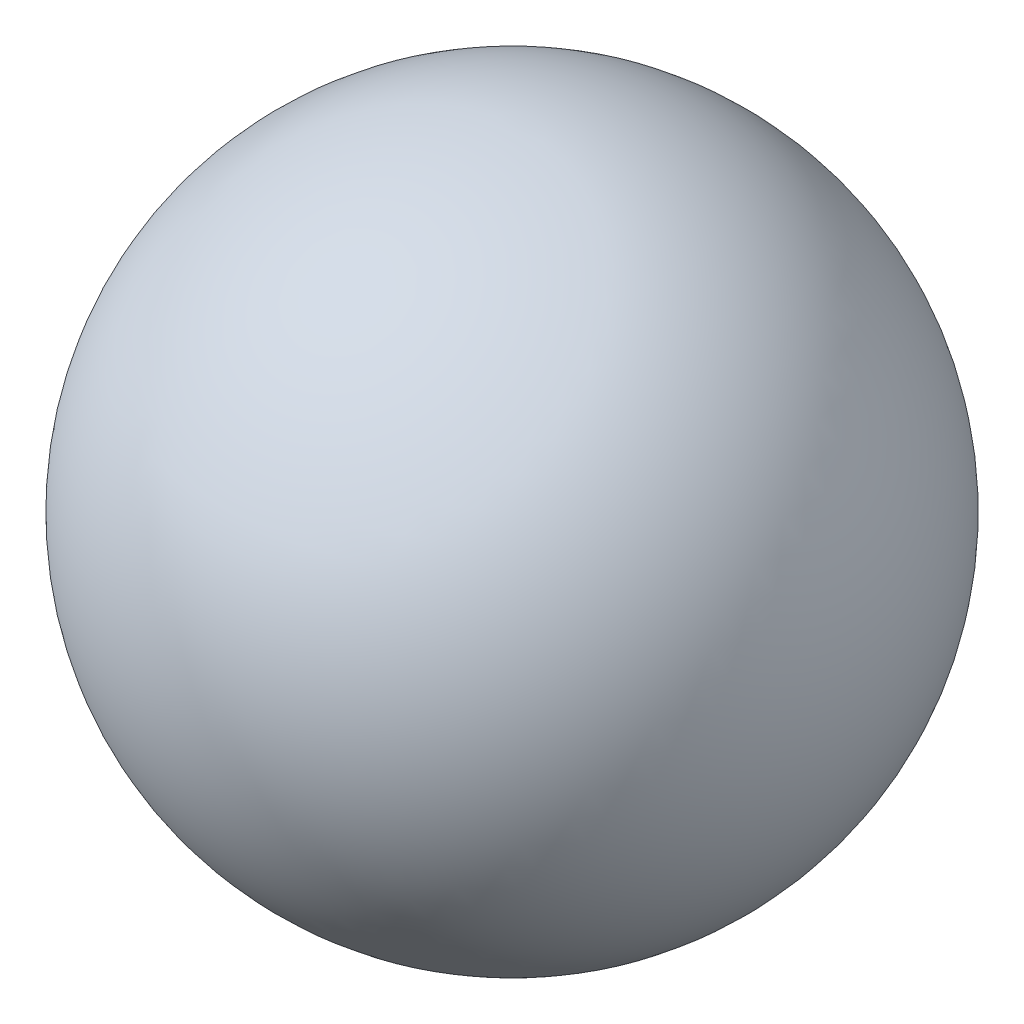
ISO-10303-21;
HEADER;
FILE_DESCRIPTION(('STEP AP214'),'2;1');
FILE_NAME('part.step','',(''),(''),'','','');
FILE_SCHEMA(('AUTOMOTIVE_DESIGN { 1 0 10303 214 1 1 1 1 }'));
ENDSEC;
DATA;
#1=APPLICATION_CONTEXT('core data for automotive mechanical design processes');
#2=APPLICATION_PROTOCOL_DEFINITION('international standard','automotive_design',2000,#1);
#3=PRODUCT_CONTEXT('',#1,'mechanical');
#4=PRODUCT('Part','Part','',(#3));
#5=PRODUCT_RELATED_PRODUCT_CATEGORY('part','',(#4));
#6=PRODUCT_DEFINITION_FORMATION('','',#4);
#7=PRODUCT_DEFINITION_CONTEXT('part definition',#1,'design');
#8=PRODUCT_DEFINITION('design','',#6,#7);
#9=PRODUCT_DEFINITION_SHAPE('','',#8);
#10=(LENGTH_UNIT() NAMED_UNIT(*) SI_UNIT(.MILLI.,.METRE.));
#11=(NAMED_UNIT(*) PLANE_ANGLE_UNIT() SI_UNIT($,.RADIAN.));
#12=(NAMED_UNIT(*) SI_UNIT($,.STERADIAN.) SOLID_ANGLE_UNIT());
#13=UNCERTAINTY_MEASURE_WITH_UNIT(LENGTH_MEASURE(1.E-05),#10,'distance_accuracy_value','');
#14=(GEOMETRIC_REPRESENTATION_CONTEXT(3) GLOBAL_UNCERTAINTY_ASSIGNED_CONTEXT((#13)) GLOBAL_UNIT_ASSIGNED_CONTEXT((#10,
#11,#12)) REPRESENTATION_CONTEXT('',''));
#15=CARTESIAN_POINT('',(0.,0.,0.));
#16=DIRECTION('',(0.,0.,1.));
#17=DIRECTION('',(1.,0.,0.));
#18=AXIS2_PLACEMENT_3D('',#15,#16,#17);
#19=CARTESIAN_POINT('',(0.,0.,0.));
#20=DIRECTION('',(0.,1.,0.));
#21=DIRECTION('',(1.,0.,0.));
#22=AXIS2_PLACEMENT_3D('',#19,#20,#21);
#23=SPHERICAL_SURFACE('',#22,67.3);
#24=CARTESIAN_POINT('',(0.,67.3,0.));
#25=VERTEX_POINT('',#24);
#26=VERTEX_LOOP('',#25);
#27=FACE_BOUND('',#26,.T.);
#28=ADVANCED_FACE('F33',(#27),#23,.T.);
#29=CLOSED_SHELL('',(#28));
#30=MANIFOLD_SOLID_BREP('B2',#29);
#31=ADVANCED_BREP_SHAPE_REPRESENTATION('',(#18,#30),#14);
#32=SHAPE_DEFINITION_REPRESENTATION(#9,#31);
ENDSEC;
END-ISO-10303-21;
